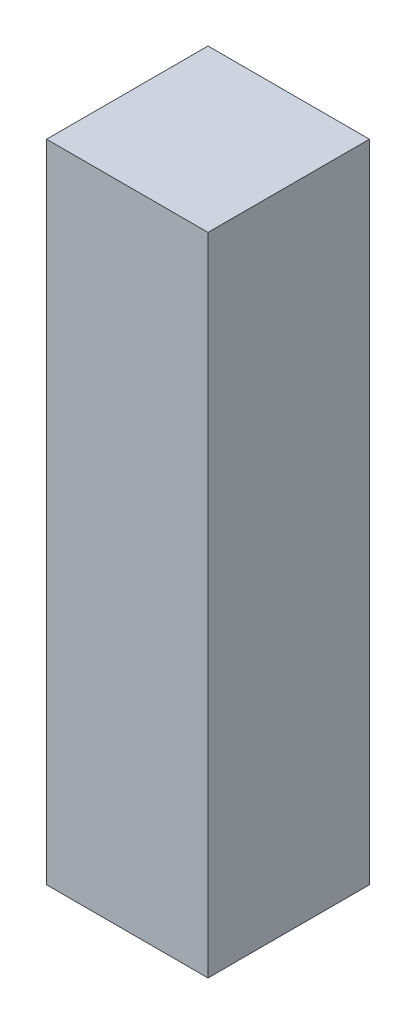
ISO-10303-21;
HEADER;
FILE_DESCRIPTION(('STEP AP214'),'2;1');
FILE_NAME('part.step','',(''),(''),'','','');
FILE_SCHEMA(('AUTOMOTIVE_DESIGN { 1 0 10303 214 1 1 1 1 }'));
ENDSEC;
DATA;
#1=APPLICATION_CONTEXT('core data for automotive mechanical design processes');
#2=APPLICATION_PROTOCOL_DEFINITION('international standard','automotive_design',2000,#1);
#3=PRODUCT_CONTEXT('',#1,'mechanical');
#4=PRODUCT('Part','Part','',(#3));
#5=PRODUCT_RELATED_PRODUCT_CATEGORY('part','',(#4));
#6=PRODUCT_DEFINITION_FORMATION('','',#4);
#7=PRODUCT_DEFINITION_CONTEXT('part definition',#1,'design');
#8=PRODUCT_DEFINITION('design','',#6,#7);
#9=PRODUCT_DEFINITION_SHAPE('','',#8);
#10=(LENGTH_UNIT() NAMED_UNIT(*) SI_UNIT(.MILLI.,.METRE.));
#11=(NAMED_UNIT(*) PLANE_ANGLE_UNIT() SI_UNIT($,.RADIAN.));
#12=(NAMED_UNIT(*) SI_UNIT($,.STERADIAN.) SOLID_ANGLE_UNIT());
#13=UNCERTAINTY_MEASURE_WITH_UNIT(LENGTH_MEASURE(1.E-05),#10,'distance_accuracy_value','');
#14=(GEOMETRIC_REPRESENTATION_CONTEXT(3) GLOBAL_UNCERTAINTY_ASSIGNED_CONTEXT((#13)) GLOBAL_UNIT_ASSIGNED_CONTEXT((#10,
#11,#12)) REPRESENTATION_CONTEXT('',''));
#15=CARTESIAN_POINT('',(0.,0.,0.));
#16=DIRECTION('',(0.,0.,1.));
#17=DIRECTION('',(1.,0.,0.));
#18=AXIS2_PLACEMENT_3D('',#15,#16,#17);
#19=CARTESIAN_POINT('',(-10.,80.,10.));
#20=DIRECTION('',(1.,0.,0.));
#21=DIRECTION('',(0.,0.,-1.));
#22=AXIS2_PLACEMENT_3D('',#19,#20,#21);
#23=PLANE('',#22);
#24=DIRECTION('',(0.,0.,1.));
#25=VECTOR('',#24,1.);
#26=CARTESIAN_POINT('',(-10.,0.,10.));
#27=LINE('',#26,#25);
#28=CARTESIAN_POINT('',(-10.,0.,-10.));
#29=VERTEX_POINT('',#28);
#30=CARTESIAN_POINT('',(-10.,0.,10.));
#31=VERTEX_POINT('',#30);
#32=EDGE_CURVE('E107',#29,#31,#27,.T.);
#33=ORIENTED_EDGE('',*,*,#32,.T.);
#34=DIRECTION('',(0.,-1.,0.));
#35=VECTOR('',#34,1.);
#36=CARTESIAN_POINT('',(-10.,80.,10.));
#37=LINE('',#36,#35);
#38=CARTESIAN_POINT('',(-10.,80.,10.));
#39=VERTEX_POINT('',#38);
#40=EDGE_CURVE('E11',#39,#31,#37,.T.);
#41=ORIENTED_EDGE('',*,*,#40,.F.);
#42=DIRECTION('',(0.,0.,1.));
#43=VECTOR('',#42,1.);
#44=CARTESIAN_POINT('',(-10.,80.,10.));
#45=LINE('',#44,#43);
#46=CARTESIAN_POINT('',(-10.,80.,-10.));
#47=VERTEX_POINT('',#46);
#48=EDGE_CURVE('E91',#47,#39,#45,.T.);
#49=ORIENTED_EDGE('',*,*,#48,.F.);
#50=DIRECTION('',(0.,-1.,0.));
#51=VECTOR('',#50,1.);
#52=CARTESIAN_POINT('',(-10.,80.,-10.));
#53=LINE('',#52,#51);
#54=EDGE_CURVE('E103',#47,#29,#53,.T.);
#55=ORIENTED_EDGE('',*,*,#54,.T.);
#56=EDGE_LOOP('',(#33,#41,#49,#55));
#57=FACE_BOUND('',#56,.T.);
#58=ADVANCED_FACE('F39',(#57),#23,.F.);
#59=CARTESIAN_POINT('',(10.,80.,10.));
#60=DIRECTION('',(0.,0.,-1.));
#61=DIRECTION('',(-1.,0.,0.));
#62=AXIS2_PLACEMENT_3D('',#59,#60,#61);
#63=PLANE('',#62);
#64=DIRECTION('',(1.,0.,0.));
#65=VECTOR('',#64,1.);
#66=CARTESIAN_POINT('',(10.,0.,10.));
#67=LINE('',#66,#65);
#68=CARTESIAN_POINT('',(10.,0.,10.));
#69=VERTEX_POINT('',#68);
#70=EDGE_CURVE('E96',#31,#69,#67,.T.);
#71=ORIENTED_EDGE('',*,*,#70,.T.);
#72=DIRECTION('',(0.,-1.,0.));
#73=VECTOR('',#72,1.);
#74=CARTESIAN_POINT('',(10.,80.,10.));
#75=LINE('',#74,#73);
#76=CARTESIAN_POINT('',(10.,80.,10.));
#77=VERTEX_POINT('',#76);
#78=EDGE_CURVE('E48',#77,#69,#75,.T.);
#79=ORIENTED_EDGE('',*,*,#78,.F.);
#80=DIRECTION('',(1.,0.,0.));
#81=VECTOR('',#80,1.);
#82=CARTESIAN_POINT('',(10.,80.,10.));
#83=LINE('',#82,#81);
#84=EDGE_CURVE('E86',#39,#77,#83,.T.);
#85=ORIENTED_EDGE('',*,*,#84,.F.);
#86=ORIENTED_EDGE('',*,*,#40,.T.);
#87=EDGE_LOOP('',(#71,#79,#85,#86));
#88=FACE_BOUND('',#87,.T.);
#89=ADVANCED_FACE('F95',(#88),#63,.F.);
#90=CARTESIAN_POINT('',(10.,80.,10.));
#91=DIRECTION('',(-1.,0.,0.));
#92=DIRECTION('',(0.,0.,1.));
#93=AXIS2_PLACEMENT_3D('',#90,#91,#92);
#94=PLANE('',#93);
#95=DIRECTION('',(0.,0.,-1.));
#96=VECTOR('',#95,1.);
#97=CARTESIAN_POINT('',(10.,0.,10.));
#98=LINE('',#97,#96);
#99=CARTESIAN_POINT('',(10.,0.,-10.));
#100=VERTEX_POINT('',#99);
#101=EDGE_CURVE('E73',#69,#100,#98,.T.);
#102=ORIENTED_EDGE('',*,*,#101,.T.);
#103=DIRECTION('',(0.,-1.,0.));
#104=VECTOR('',#103,1.);
#105=CARTESIAN_POINT('',(10.,80.,-10.));
#106=LINE('',#105,#104);
#107=CARTESIAN_POINT('',(10.,80.,-10.));
#108=VERTEX_POINT('',#107);
#109=EDGE_CURVE('E98',#108,#100,#106,.T.);
#110=ORIENTED_EDGE('',*,*,#109,.F.);
#111=DIRECTION('',(0.,0.,-1.));
#112=VECTOR('',#111,1.);
#113=CARTESIAN_POINT('',(10.,80.,10.));
#114=LINE('',#113,#112);
#115=EDGE_CURVE('E89',#77,#108,#114,.T.);
#116=ORIENTED_EDGE('',*,*,#115,.F.);
#117=ORIENTED_EDGE('',*,*,#78,.T.);
#118=EDGE_LOOP('',(#102,#110,#116,#117));
#119=FACE_BOUND('',#118,.T.);
#120=ADVANCED_FACE('F99',(#119),#94,.F.);
#121=CARTESIAN_POINT('',(10.,80.,-10.));
#122=DIRECTION('',(0.,0.,1.));
#123=DIRECTION('',(1.,0.,0.));
#124=AXIS2_PLACEMENT_3D('',#121,#122,#123);
#125=PLANE('',#124);
#126=DIRECTION('',(-1.,0.,0.));
#127=VECTOR('',#126,1.);
#128=CARTESIAN_POINT('',(10.,0.,-10.));
#129=LINE('',#128,#127);
#130=EDGE_CURVE('E79',#100,#29,#129,.T.);
#131=ORIENTED_EDGE('',*,*,#130,.T.);
#132=ORIENTED_EDGE('',*,*,#54,.F.);
#133=DIRECTION('',(-1.,0.,0.));
#134=VECTOR('',#133,1.);
#135=CARTESIAN_POINT('',(10.,80.,-10.));
#136=LINE('',#135,#134);
#137=EDGE_CURVE('E56',#108,#47,#136,.T.);
#138=ORIENTED_EDGE('',*,*,#137,.F.);
#139=ORIENTED_EDGE('',*,*,#109,.T.);
#140=EDGE_LOOP('',(#131,#132,#138,#139));
#141=FACE_BOUND('',#140,.T.);
#142=ADVANCED_FACE('F120',(#141),#125,.F.);
#143=CARTESIAN_POINT('',(0.,80.,0.));
#144=DIRECTION('',(0.,1.,0.));
#145=DIRECTION('',(0.,0.,1.));
#146=AXIS2_PLACEMENT_3D('',#143,#144,#145);
#147=PLANE('',#146);
#148=ORIENTED_EDGE('',*,*,#48,.T.);
#149=ORIENTED_EDGE('',*,*,#84,.T.);
#150=ORIENTED_EDGE('',*,*,#115,.T.);
#151=ORIENTED_EDGE('',*,*,#137,.T.);
#152=EDGE_LOOP('',(#148,#149,#150,#151));
#153=FACE_BOUND('',#152,.T.);
#154=ADVANCED_FACE('F87',(#153),#147,.T.);
#155=CARTESIAN_POINT('',(0.,0.,0.));
#156=DIRECTION('',(0.,1.,0.));
#157=DIRECTION('',(0.,0.,1.));
#158=AXIS2_PLACEMENT_3D('',#155,#156,#157);
#159=PLANE('',#158);
#160=ORIENTED_EDGE('',*,*,#32,.F.);
#161=ORIENTED_EDGE('',*,*,#130,.F.);
#162=ORIENTED_EDGE('',*,*,#101,.F.);
#163=ORIENTED_EDGE('',*,*,#70,.F.);
#164=EDGE_LOOP('',(#160,#161,#162,#163));
#165=FACE_BOUND('',#164,.T.);
#166=ADVANCED_FACE('F123',(#165),#159,.F.);
#167=CLOSED_SHELL('',(#58,#89,#120,#142,#154,#166));
#168=MANIFOLD_SOLID_BREP('B2',#167);
#169=ADVANCED_BREP_SHAPE_REPRESENTATION('',(#18,#168),#14);
#170=SHAPE_DEFINITION_REPRESENTATION(#9,#169);
ENDSEC;
END-ISO-10303-21;
